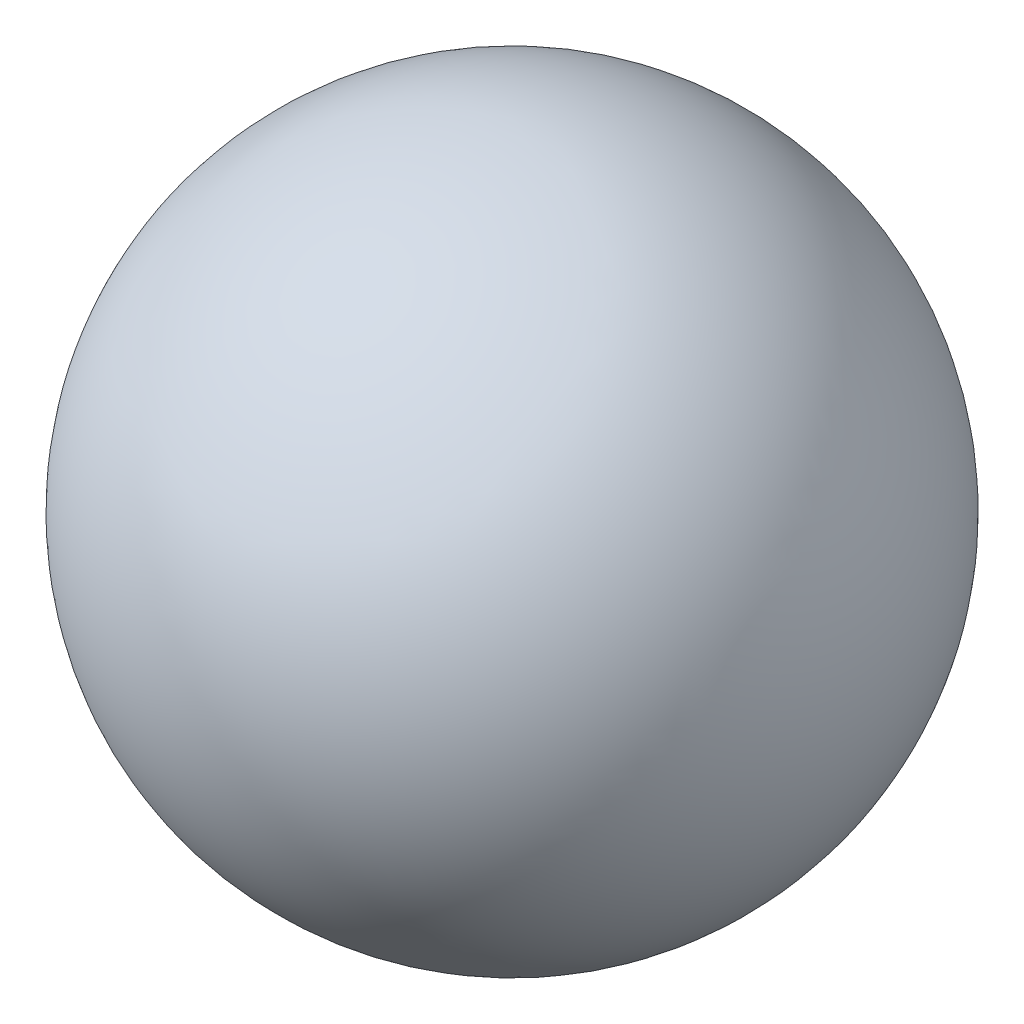
ISO-10303-21;
HEADER;
FILE_DESCRIPTION(('STEP AP214'),'2;1');
FILE_NAME('part.step','',(''),(''),'','','');
FILE_SCHEMA(('AUTOMOTIVE_DESIGN { 1 0 10303 214 1 1 1 1 }'));
ENDSEC;
DATA;
#1=APPLICATION_CONTEXT('core data for automotive mechanical design processes');
#2=APPLICATION_PROTOCOL_DEFINITION('international standard','automotive_design',2000,#1);
#3=PRODUCT_CONTEXT('',#1,'mechanical');
#4=PRODUCT('Part','Part','',(#3));
#5=PRODUCT_RELATED_PRODUCT_CATEGORY('part','',(#4));
#6=PRODUCT_DEFINITION_FORMATION('','',#4);
#7=PRODUCT_DEFINITION_CONTEXT('part definition',#1,'design');
#8=PRODUCT_DEFINITION('design','',#6,#7);
#9=PRODUCT_DEFINITION_SHAPE('','',#8);
#10=(LENGTH_UNIT() NAMED_UNIT(*) SI_UNIT(.MILLI.,.METRE.));
#11=(NAMED_UNIT(*) PLANE_ANGLE_UNIT() SI_UNIT($,.RADIAN.));
#12=(NAMED_UNIT(*) SI_UNIT($,.STERADIAN.) SOLID_ANGLE_UNIT());
#13=UNCERTAINTY_MEASURE_WITH_UNIT(LENGTH_MEASURE(1.E-05),#10,'distance_accuracy_value','');
#14=(GEOMETRIC_REPRESENTATION_CONTEXT(3) GLOBAL_UNCERTAINTY_ASSIGNED_CONTEXT((#13)) GLOBAL_UNIT_ASSIGNED_CONTEXT((#10,
#11,#12)) REPRESENTATION_CONTEXT('',''));
#15=CARTESIAN_POINT('',(0.,0.,0.));
#16=DIRECTION('',(0.,0.,1.));
#17=DIRECTION('',(1.,0.,0.));
#18=AXIS2_PLACEMENT_3D('',#15,#16,#17);
#19=CARTESIAN_POINT('',(0.,0.,0.));
#20=DIRECTION('',(1.,0.,0.));
#21=DIRECTION('',(0.,-1.,0.));
#22=AXIS2_PLACEMENT_3D('',#19,#20,#21);
#23=SPHERICAL_SURFACE('',#22,40.);
#24=CARTESIAN_POINT('',(40.,0.,0.));
#25=VERTEX_POINT('',#24);
#26=VERTEX_LOOP('',#25);
#27=FACE_BOUND('',#26,.T.);
#28=ADVANCED_FACE('F29',(#27),#23,.T.);
#29=CLOSED_SHELL('',(#28));
#30=MANIFOLD_SOLID_BREP('B2',#29);
#31=ADVANCED_BREP_SHAPE_REPRESENTATION('',(#18,#30),#14);
#32=SHAPE_DEFINITION_REPRESENTATION(#9,#31);
ENDSEC;
END-ISO-10303-21;
